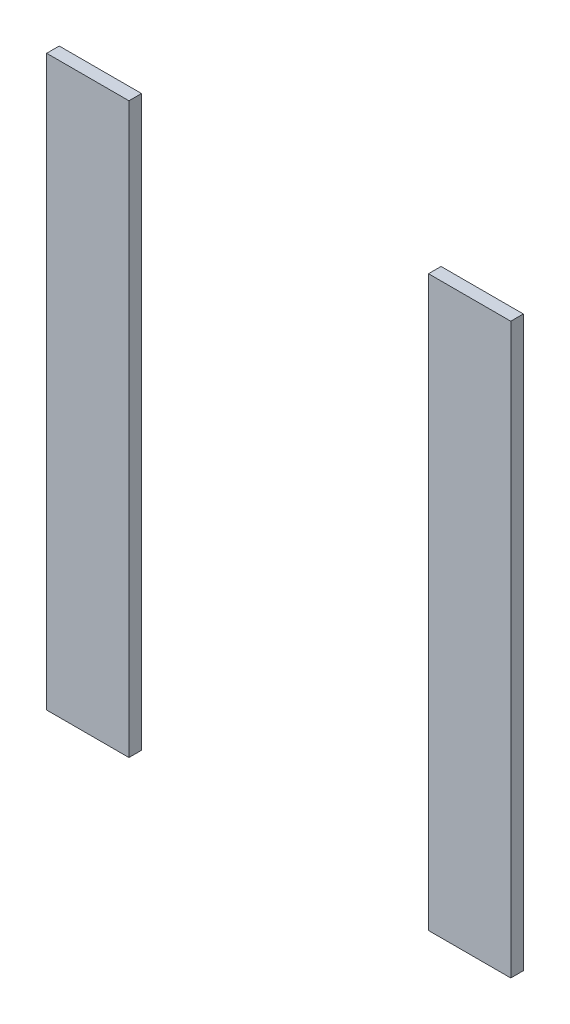
ISO-10303-21;
HEADER;
FILE_DESCRIPTION(('STEP AP214'),'2;1');
FILE_NAME('part.step','',(''),(''),'','','');
FILE_SCHEMA(('AUTOMOTIVE_DESIGN { 1 0 10303 214 1 1 1 1 }'));
ENDSEC;
DATA;
#1=APPLICATION_CONTEXT('core data for automotive mechanical design processes');
#2=APPLICATION_PROTOCOL_DEFINITION('international standard','automotive_design',2000,#1);
#3=PRODUCT_CONTEXT('',#1,'mechanical');
#4=PRODUCT('Part','Part','',(#3));
#5=PRODUCT_RELATED_PRODUCT_CATEGORY('part','',(#4));
#6=PRODUCT_DEFINITION_FORMATION('','',#4);
#7=PRODUCT_DEFINITION_CONTEXT('part definition',#1,'design');
#8=PRODUCT_DEFINITION('design','',#6,#7);
#9=PRODUCT_DEFINITION_SHAPE('','',#8);
#10=(LENGTH_UNIT() NAMED_UNIT(*) SI_UNIT(.MILLI.,.METRE.));
#11=(NAMED_UNIT(*) PLANE_ANGLE_UNIT() SI_UNIT($,.RADIAN.));
#12=(NAMED_UNIT(*) SI_UNIT($,.STERADIAN.) SOLID_ANGLE_UNIT());
#13=UNCERTAINTY_MEASURE_WITH_UNIT(LENGTH_MEASURE(1.E-05),#10,'distance_accuracy_value','');
#14=(GEOMETRIC_REPRESENTATION_CONTEXT(3) GLOBAL_UNCERTAINTY_ASSIGNED_CONTEXT((#13)) GLOBAL_UNIT_ASSIGNED_CONTEXT((#10,
#11,#12)) REPRESENTATION_CONTEXT('',''));
#15=CARTESIAN_POINT('',(0.,0.,0.));
#16=DIRECTION('',(0.,0.,1.));
#17=DIRECTION('',(1.,0.,0.));
#18=AXIS2_PLACEMENT_3D('',#15,#16,#17);
#19=CARTESIAN_POINT('',(60.500001082798,52.361183597524,-2.528992530379));
#20=DIRECTION('',(0.,-8.74227765734797E-08,0.999999999999996));
#21=DIRECTION('',(0.,-0.999999999999996,-8.74227765734797E-08));
#22=AXIS2_PLACEMENT_3D('',#19,#20,#21);
#23=PLANE('',#22);
#24=DIRECTION('',(4.371138828674E-08,0.999999999999999,0.));
#25=VECTOR('',#24,1.);
#26=CARTESIAN_POINT('',(63.06100122,55.500000574766,-2.528991981571));
#27=LINE('',#26,#25);
#28=CARTESIAN_POINT('',(63.06100122,58.6388176548538,-2.5289919815709));
#29=VERTEX_POINT('',#28);
#30=CARTESIAN_POINT('',(63.061001082798,52.3611835054274,-2.528992393177));
#31=VERTEX_POINT('',#30);
#32=EDGE_CURVE('P0_E55',#29,#31,#27,.F.);
#33=ORIENTED_EDGE('',*,*,#32,.F.);
#34=DIRECTION('',(0.999999999999999,-4.37113882867396E-08,0.));
#35=VECTOR('',#34,1.);
#36=CARTESIAN_POINT('',(60.500001357202,58.638817763765,-2.52899198157099));
#37=LINE('',#36,#35);
#38=CARTESIAN_POINT('',(62.1528701636241,58.6388176876587,-2.52899198157095));
#39=VERTEX_POINT('',#38);
#40=EDGE_CURVE('P0_E68',#39,#29,#37,.T.);
#41=ORIENTED_EDGE('',*,*,#40,.F.);
#42=DIRECTION('',(4.371138828674E-08,0.999999999999999,0.));
#43=VECTOR('',#42,1.);
#44=CARTESIAN_POINT('',(62.152870209486,59.688012391382,-2.528991981571));
#45=LINE('',#44,#43);
#46=CARTESIAN_POINT('',(62.152870026422,52.3611835252751,-2.528992393177));
#47=VERTEX_POINT('',#46);
#48=EDGE_CURVE('P0_E61',#39,#47,#45,.F.);
#49=ORIENTED_EDGE('',*,*,#48,.T.);
#50=DIRECTION('',(1.,0.,0.));
#51=VECTOR('',#50,1.);
#52=CARTESIAN_POINT('',(60.500001082798,52.361183525275,-2.52899253037901));
#53=LINE('',#52,#51);
#54=EDGE_CURVE('P0_E20',#47,#31,#53,.T.);
#55=ORIENTED_EDGE('',*,*,#54,.T.);
#56=EDGE_LOOP('',(#33,#41,#49,#55));
#57=FACE_BOUND('',#56,.T.);
#58=ADVANCED_FACE('P0_F17',(#57),#23,.T.);
#59=CARTESIAN_POINT('',(62.152870209486,59.688012391382,-2.66777166144));
#60=DIRECTION('',(0.999999999999999,-4.371138828674E-08,0.));
#61=DIRECTION('',(4.371138828674E-08,0.999999999999999,0.));
#62=AXIS2_PLACEMENT_3D('',#59,#60,#61);
#63=PLANE('',#62);
#64=ORIENTED_EDGE('',*,*,#48,.F.);
#65=DIRECTION('',(0.,-8.74227765734797E-08,0.999999999999996));
#66=VECTOR('',#65,1.);
#67=CARTESIAN_POINT('',(62.152870163624,58.6388176915158,-2.52899198157101));
#68=LINE('',#67,#66);
#69=CARTESIAN_POINT('',(62.1528700950231,58.6388177036488,-2.667772027568));
#70=VERTEX_POINT('',#69);
#71=EDGE_CURVE('P0_E64',#70,#39,#68,.T.);
#72=ORIENTED_EDGE('',*,*,#71,.F.);
#73=DIRECTION('',(0.,0.999999999999996,8.74227765734797E-08));
#74=VECTOR('',#73,1.);
#75=CARTESIAN_POINT('',(62.15286988922,58.638817775898,-2.667771753164));
#76=LINE('',#75,#74);
#77=CARTESIAN_POINT('',(62.1528698892201,52.3611835214175,-2.66777230197205));
#78=VERTEX_POINT('',#77);
#79=EDGE_CURVE('P0_E83',#78,#70,#76,.T.);
#80=ORIENTED_EDGE('',*,*,#79,.F.);
#81=DIRECTION('',(0.,8.74227765734797E-08,-0.999999999999996));
#82=VECTOR('',#81,1.);
#83=CARTESIAN_POINT('',(62.15286988922,52.3611835374078,-2.66777230197201));
#84=LINE('',#83,#82);
#85=EDGE_CURVE('P0_E67',#47,#78,#84,.T.);
#86=ORIENTED_EDGE('',*,*,#85,.F.);
#87=EDGE_LOOP('',(#64,#72,#80,#86));
#88=FACE_BOUND('',#87,.T.);
#89=ADVANCED_FACE('P0_F62',(#88),#63,.F.);
#90=CARTESIAN_POINT('',(60.500001357202,58.638817763765,-2.528991981571));
#91=DIRECTION('',(4.37113882867398E-08,0.999999999999995,8.74227765734796E-08));
#92=DIRECTION('',(0.,-8.74227765734797E-08,0.999999999999996));
#93=AXIS2_PLACEMENT_3D('',#90,#91,#92);
#94=PLANE('',#93);
#95=DIRECTION('',(0.,0.,1.));
#96=VECTOR('',#95,1.);
#97=CARTESIAN_POINT('',(63.0610013572021,58.638817663953,-2.598382141771));
#98=LINE('',#97,#96);
#99=CARTESIAN_POINT('',(63.061001357202,58.6388176738768,-2.667771890366));
#100=VERTEX_POINT('',#99);
#101=EDGE_CURVE('P0_E79',#100,#29,#98,.T.);
#102=ORIENTED_EDGE('',*,*,#101,.F.);
#103=DIRECTION('',(1.,0.,0.));
#104=VECTOR('',#103,1.);
#105=CARTESIAN_POINT('',(60.500001357202,58.638817703649,-2.66777175316401));
#106=LINE('',#105,#104);
#107=EDGE_CURVE('P0_E74',#70,#100,#106,.T.);
#108=ORIENTED_EDGE('',*,*,#107,.F.);
#109=ORIENTED_EDGE('',*,*,#71,.T.);
#110=ORIENTED_EDGE('',*,*,#40,.T.);
#111=EDGE_LOOP('',(#102,#108,#109,#110));
#112=FACE_BOUND('',#111,.T.);
#113=ADVANCED_FACE('P0_F72',(#112),#94,.T.);
#114=CARTESIAN_POINT('',(63.06100122,55.500000574766,-2.598382141771));
#115=DIRECTION('',(0.999999999999999,-4.371138828674E-08,0.));
#116=DIRECTION('',(4.371138828674E-08,0.999999999999999,0.));
#117=AXIS2_PLACEMENT_3D('',#114,#115,#116);
#118=PLANE('',#117);
#119=DIRECTION('',(0.,0.999999999999996,8.74227765734797E-08));
#120=VECTOR('',#119,1.);
#121=CARTESIAN_POINT('',(63.061001357202,58.638817775898,-2.667771753164));
#122=LINE('',#121,#120);
#123=CARTESIAN_POINT('',(63.061001151399,52.361183491646,-2.66777230197206));
#124=VERTEX_POINT('',#123);
#125=EDGE_CURVE('P0_E26',#100,#124,#122,.F.);
#126=ORIENTED_EDGE('',*,*,#125,.F.);
#127=ORIENTED_EDGE('',*,*,#101,.T.);
#128=ORIENTED_EDGE('',*,*,#32,.T.);
#129=DIRECTION('',(0.,8.74227765734797E-08,-0.999999999999996));
#130=VECTOR('',#129,1.);
#131=CARTESIAN_POINT('',(63.061001082798,52.3611834977121,-2.66777230197201));
#132=LINE('',#131,#130);
#133=EDGE_CURVE('P0_E35',#124,#31,#132,.F.);
#134=ORIENTED_EDGE('',*,*,#133,.F.);
#135=EDGE_LOOP('',(#126,#127,#128,#134));
#136=FACE_BOUND('',#135,.T.);
#137=ADVANCED_FACE('P0_F89',(#136),#118,.T.);
#138=CARTESIAN_POINT('',(60.500001082798,52.361183609657,-2.667772301972));
#139=DIRECTION('',(-4.37113882867398E-08,-0.999999999999995,-8.74227765734796E-08));
#140=DIRECTION('',(0.,8.74227765734797E-08,-0.999999999999996));
#141=AXIS2_PLACEMENT_3D('',#138,#139,#140);
#142=PLANE('',#141);
#143=ORIENTED_EDGE('',*,*,#133,.T.);
#144=ORIENTED_EDGE('',*,*,#54,.F.);
#145=ORIENTED_EDGE('',*,*,#85,.T.);
#146=DIRECTION('',(1.,0.,0.));
#147=VECTOR('',#146,1.);
#148=CARTESIAN_POINT('',(60.500001357202,52.361183497712,-2.66777230197222));
#149=LINE('',#148,#147);
#150=EDGE_CURVE('P0_E11',#124,#78,#149,.F.);
#151=ORIENTED_EDGE('',*,*,#150,.F.);
#152=EDGE_LOOP('',(#143,#144,#145,#151));
#153=FACE_BOUND('',#152,.T.);
#154=ADVANCED_FACE('P0_F91',(#153),#142,.T.);
#155=CARTESIAN_POINT('',(60.500001357202,58.638817775898,-2.667771753164));
#156=DIRECTION('',(0.,8.74227765734797E-08,-0.999999999999996));
#157=DIRECTION('',(0.,0.999999999999996,8.74227765734797E-08));
#158=AXIS2_PLACEMENT_3D('',#155,#156,#157);
#159=PLANE('',#158);
#160=ORIENTED_EDGE('',*,*,#125,.T.);
#161=ORIENTED_EDGE('',*,*,#150,.T.);
#162=ORIENTED_EDGE('',*,*,#79,.T.);
#163=ORIENTED_EDGE('',*,*,#107,.T.);
#164=EDGE_LOOP('',(#160,#161,#162,#163));
#165=FACE_BOUND('',#164,.T.);
#166=ADVANCED_FACE('P0_F88',(#165),#159,.T.);
#167=CLOSED_SHELL('',(#58,#89,#113,#137,#154,#166));
#168=MANIFOLD_SOLID_BREP('P0_B1',#167);
#169=CARTESIAN_POINT('',(60.500001082798,52.361183597524,-2.528992530379));
#170=DIRECTION('',(0.,-8.74227765734797E-08,0.999999999999996));
#171=DIRECTION('',(0.,-0.999999999999996,-8.74227765734797E-08));
#172=AXIS2_PLACEMENT_3D('',#169,#170,#171);
#173=PLANE('',#172);
#174=DIRECTION('',(-4.371138828674E-08,-0.999999999999999,0.));
#175=VECTOR('',#174,1.);
#176=CARTESIAN_POINT('',(57.93900122,55.500000798656,-2.528992530379));
#177=LINE('',#176,#175);
#178=CARTESIAN_POINT('',(57.93900122,52.3611837125023,-2.52899253037899));
#179=VERTEX_POINT('',#178);
#180=CARTESIAN_POINT('',(57.939001357202,58.6388178558625,-2.52899211877289));
#181=VERTEX_POINT('',#180);
#182=EDGE_CURVE('P1_E55',#179,#181,#177,.F.);
#183=ORIENTED_EDGE('',*,*,#182,.F.);
#184=DIRECTION('',(0.999999999999999,-4.37113882867396E-08,0.));
#185=VECTOR('',#184,1.);
#186=CARTESIAN_POINT('',(60.500001082798,52.3611835975245,-2.52899253037901));
#187=LINE('',#186,#185);
#188=CARTESIAN_POINT('',(58.8471322763759,52.3611836857637,-2.528992530379));
#189=VERTEX_POINT('',#188);
#190=EDGE_CURVE('P1_E68',#189,#179,#187,.F.);
#191=ORIENTED_EDGE('',*,*,#190,.F.);
#192=DIRECTION('',(-4.371138828674E-08,-0.999999999999999,0.));
#193=VECTOR('',#192,1.);
#194=CARTESIAN_POINT('',(58.847132230514,51.311988994172,-2.528992530379));
#195=LINE('',#194,#193);
#196=CARTESIAN_POINT('',(58.847132413578,58.6388178360148,-2.52899211877289));
#197=VERTEX_POINT('',#196);
#198=EDGE_CURVE('P1_E61',#189,#197,#195,.F.);
#199=ORIENTED_EDGE('',*,*,#198,.T.);
#200=DIRECTION('',(1.,0.,0.));
#201=VECTOR('',#200,1.);
#202=CARTESIAN_POINT('',(60.500001082798,58.638817836015,-2.52899198157078));
#203=LINE('',#202,#201);
#204=EDGE_CURVE('P1_E20',#197,#181,#203,.F.);
#205=ORIENTED_EDGE('',*,*,#204,.T.);
#206=EDGE_LOOP('',(#183,#191,#199,#205));
#207=FACE_BOUND('',#206,.T.);
#208=ADVANCED_FACE('P1_F17',(#207),#173,.T.);
#209=CARTESIAN_POINT('',(58.847132230514,51.311988994172,-2.667772393695));
#210=DIRECTION('',(-0.999999999999999,4.371138828674E-08,0.));
#211=DIRECTION('',(-4.371138828674E-08,-0.999999999999999,0.));
#212=AXIS2_PLACEMENT_3D('',#209,#210,#211);
#213=PLANE('',#212);
#214=DIRECTION('',(0.,0.999999999999996,8.74227765734797E-08));
#215=VECTOR('',#214,1.);
#216=CARTESIAN_POINT('',(58.84713255078,58.638817775898,-2.667771753164));
#217=LINE('',#216,#215);
#218=CARTESIAN_POINT('',(58.8471325507799,58.6388178520049,-2.667771753164));
#219=VERTEX_POINT('',#218);
#220=CARTESIAN_POINT('',(58.8471323449769,52.361183681906,-2.66777202756805));
#221=VERTEX_POINT('',#220);
#222=EDGE_CURVE('P1_E83',#219,#221,#217,.F.);
#223=ORIENTED_EDGE('',*,*,#222,.F.);
#224=DIRECTION('',(0.,-8.74227765734797E-08,0.999999999999996));
#225=VECTOR('',#224,1.);
#226=CARTESIAN_POINT('',(58.84713255078,58.6388178360142,-2.52899198157099));
#227=LINE('',#226,#225);
#228=EDGE_CURVE('P1_E67',#197,#219,#227,.F.);
#229=ORIENTED_EDGE('',*,*,#228,.F.);
#230=ORIENTED_EDGE('',*,*,#198,.F.);
#231=DIRECTION('',(0.,8.74227765734797E-08,-0.999999999999996));
#232=VECTOR('',#231,1.);
#233=CARTESIAN_POINT('',(58.847132276376,52.3611836819062,-2.66777230197199));
#234=LINE('',#233,#232);
#235=EDGE_CURVE('P1_E64',#221,#189,#234,.F.);
#236=ORIENTED_EDGE('',*,*,#235,.F.);
#237=EDGE_LOOP('',(#223,#229,#230,#236));
#238=FACE_BOUND('',#237,.T.);
#239=ADVANCED_FACE('P1_F62',(#238),#213,.F.);
#240=CARTESIAN_POINT('',(60.500001082798,52.361183609657,-2.667772301972));
#241=DIRECTION('',(-4.37113882867398E-08,-0.999999999999995,-8.74227765734796E-08));
#242=DIRECTION('',(0.,8.74227765734797E-08,-0.999999999999996));
#243=AXIS2_PLACEMENT_3D('',#240,#241,#242);
#244=PLANE('',#243);
#245=DIRECTION('',(0.,0.,1.));
#246=VECTOR('',#245,1.);
#247=CARTESIAN_POINT('',(57.9390010827979,52.361183721602,-2.598382141771));
#248=LINE('',#247,#246);
#249=CARTESIAN_POINT('',(57.939001082798,52.3611837116779,-2.66777216477005));
#250=VERTEX_POINT('',#249);
#251=EDGE_CURVE('P1_E79',#250,#179,#248,.T.);
#252=ORIENTED_EDGE('',*,*,#251,.F.);
#253=DIRECTION('',(1.,0.,0.));
#254=VECTOR('',#253,1.);
#255=CARTESIAN_POINT('',(60.500001357202,52.361183681906,-2.6677723019722));
#256=LINE('',#255,#254);
#257=EDGE_CURVE('P1_E74',#221,#250,#256,.F.);
#258=ORIENTED_EDGE('',*,*,#257,.F.);
#259=ORIENTED_EDGE('',*,*,#235,.T.);
#260=ORIENTED_EDGE('',*,*,#190,.T.);
#261=EDGE_LOOP('',(#252,#258,#259,#260));
#262=FACE_BOUND('',#261,.T.);
#263=ADVANCED_FACE('P1_F72',(#262),#244,.T.);
#264=CARTESIAN_POINT('',(57.93900122,55.500000798656,-2.598382141771));
#265=DIRECTION('',(-0.999999999999999,4.371138828674E-08,0.));
#266=DIRECTION('',(-4.371138828674E-08,-0.999999999999999,0.));
#267=AXIS2_PLACEMENT_3D('',#264,#265,#266);
#268=PLANE('',#267);
#269=DIRECTION('',(0.,0.999999999999996,8.74227765734797E-08));
#270=VECTOR('',#269,1.);
#271=CARTESIAN_POINT('',(57.939001082798,58.638817775898,-2.667771753164));
#272=LINE('',#271,#270);
#273=CARTESIAN_POINT('',(57.939001288601,58.6388178817763,-2.667771753164));
#274=VERTEX_POINT('',#273);
#275=EDGE_CURVE('P1_E26',#250,#274,#272,.T.);
#276=ORIENTED_EDGE('',*,*,#275,.F.);
#277=ORIENTED_EDGE('',*,*,#251,.T.);
#278=ORIENTED_EDGE('',*,*,#182,.T.);
#279=DIRECTION('',(0.,-8.74227765734797E-08,0.999999999999996));
#280=VECTOR('',#279,1.);
#281=CARTESIAN_POINT('',(57.939001357202,58.6388178757099,-2.52899198157099));
#282=LINE('',#281,#280);
#283=EDGE_CURVE('P1_E35',#274,#181,#282,.T.);
#284=ORIENTED_EDGE('',*,*,#283,.F.);
#285=EDGE_LOOP('',(#276,#277,#278,#284));
#286=FACE_BOUND('',#285,.T.);
#287=ADVANCED_FACE('P1_F89',(#286),#268,.T.);
#288=CARTESIAN_POINT('',(60.500001357202,58.638817763765,-2.528991981571));
#289=DIRECTION('',(4.37113882867398E-08,0.999999999999995,8.74227765734796E-08));
#290=DIRECTION('',(0.,-8.74227765734797E-08,0.999999999999996));
#291=AXIS2_PLACEMENT_3D('',#288,#289,#290);
#292=PLANE('',#291);
#293=ORIENTED_EDGE('',*,*,#283,.T.);
#294=ORIENTED_EDGE('',*,*,#204,.F.);
#295=ORIENTED_EDGE('',*,*,#228,.T.);
#296=DIRECTION('',(1.,0.,0.));
#297=VECTOR('',#296,1.);
#298=CARTESIAN_POINT('',(60.500001357202,58.638817887843,-2.66777175316399));
#299=LINE('',#298,#297);
#300=EDGE_CURVE('P1_E11',#274,#219,#299,.T.);
#301=ORIENTED_EDGE('',*,*,#300,.F.);
#302=EDGE_LOOP('',(#293,#294,#295,#301));
#303=FACE_BOUND('',#302,.T.);
#304=ADVANCED_FACE('P1_F91',(#303),#292,.T.);
#305=CARTESIAN_POINT('',(60.500001357202,58.638817775898,-2.667771753164));
#306=DIRECTION('',(0.,8.74227765734797E-08,-0.999999999999996));
#307=DIRECTION('',(0.,0.999999999999996,8.74227765734797E-08));
#308=AXIS2_PLACEMENT_3D('',#305,#306,#307);
#309=PLANE('',#308);
#310=ORIENTED_EDGE('',*,*,#275,.T.);
#311=ORIENTED_EDGE('',*,*,#300,.T.);
#312=ORIENTED_EDGE('',*,*,#222,.T.);
#313=ORIENTED_EDGE('',*,*,#257,.T.);
#314=EDGE_LOOP('',(#310,#311,#312,#313));
#315=FACE_BOUND('',#314,.T.);
#316=ADVANCED_FACE('P1_F88',(#315),#309,.T.);
#317=CLOSED_SHELL('',(#208,#239,#263,#287,#304,#316));
#318=MANIFOLD_SOLID_BREP('P1_B1',#317);
#319=ADVANCED_BREP_SHAPE_REPRESENTATION('',(#18,#168,#318),#14);
#320=SHAPE_DEFINITION_REPRESENTATION(#9,#319);
ENDSEC;
END-ISO-10303-21;
